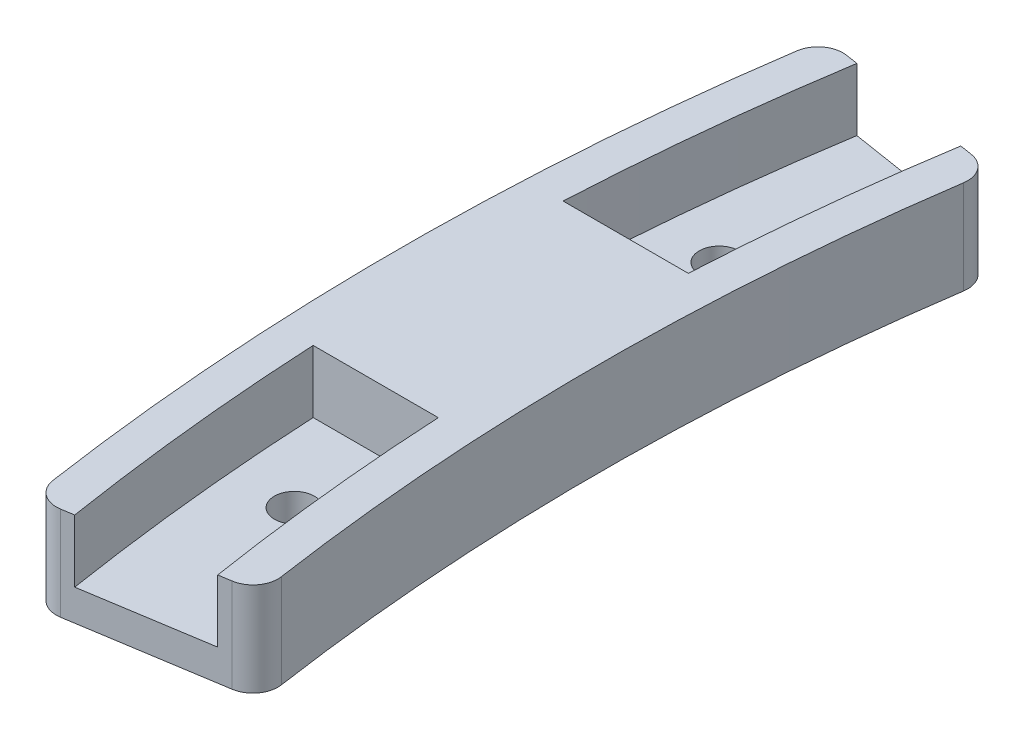
ISO-10303-21;
HEADER;
FILE_DESCRIPTION(('STEP AP214'),'2;1');
FILE_NAME('part.step','',(''),(''),'','','');
FILE_SCHEMA(('AUTOMOTIVE_DESIGN { 1 0 10303 214 1 1 1 1 }'));
ENDSEC;
DATA;
#1=APPLICATION_CONTEXT('core data for automotive mechanical design processes');
#2=APPLICATION_PROTOCOL_DEFINITION('international standard','automotive_design',2000,#1);
#3=PRODUCT_CONTEXT('',#1,'mechanical');
#4=PRODUCT('Part','Part','',(#3));
#5=PRODUCT_RELATED_PRODUCT_CATEGORY('part','',(#4));
#6=PRODUCT_DEFINITION_FORMATION('','',#4);
#7=PRODUCT_DEFINITION_CONTEXT('part definition',#1,'design');
#8=PRODUCT_DEFINITION('design','',#6,#7);
#9=PRODUCT_DEFINITION_SHAPE('','',#8);
#10=(LENGTH_UNIT() NAMED_UNIT(*) SI_UNIT(.MILLI.,.METRE.));
#11=(NAMED_UNIT(*) PLANE_ANGLE_UNIT() SI_UNIT($,.RADIAN.));
#12=(NAMED_UNIT(*) SI_UNIT($,.STERADIAN.) SOLID_ANGLE_UNIT());
#13=UNCERTAINTY_MEASURE_WITH_UNIT(LENGTH_MEASURE(1.E-05),#10,'distance_accuracy_value','');
#14=(GEOMETRIC_REPRESENTATION_CONTEXT(3) GLOBAL_UNCERTAINTY_ASSIGNED_CONTEXT((#13)) GLOBAL_UNIT_ASSIGNED_CONTEXT((#10,
#11,#12)) REPRESENTATION_CONTEXT('',''));
#15=CARTESIAN_POINT('',(0.,0.,0.));
#16=DIRECTION('',(0.,0.,1.));
#17=DIRECTION('',(1.,0.,0.));
#18=AXIS2_PLACEMENT_3D('',#15,#16,#17);
#19=CARTESIAN_POINT('',(0.,10.,0.));
#20=DIRECTION('',(0.156434465040231,0.,0.987688340595138));
#21=DIRECTION('',(0.987688340595138,0.,-0.156434465040231));
#22=AXIS2_PLACEMENT_3D('',#19,#20,#21);
#23=PLANE('',#22);
#24=DIRECTION('',(0.,1.,0.));
#25=VECTOR('',#24,1.);
#26=CARTESIAN_POINT('',(-198.515528471673,0.,31.4417708727155));
#27=LINE('',#26,#25);
#28=CARTESIAN_POINT('',(-198.515528471673,10.,31.4417708727155));
#29=VERTEX_POINT('',#28);
#30=CARTESIAN_POINT('',(-198.515528471673,2.5,31.4417708727155));
#31=VERTEX_POINT('',#30);
#32=EDGE_CURVE('E11',#29,#31,#27,.F.);
#33=ORIENTED_EDGE('',*,*,#32,.T.);
#34=DIRECTION('',(-0.987688340595138,0.,0.15643446504023));
#35=VECTOR('',#34,1.);
#36=CARTESIAN_POINT('',(-186.662644351399,2.5,29.5644584550944));
#37=LINE('',#36,#35);
#38=CARTESIAN_POINT('',(-186.662644351399,2.5,29.5644584550944));
#39=VERTEX_POINT('',#38);
#40=EDGE_CURVE('E154',#39,#31,#37,.T.);
#41=ORIENTED_EDGE('',*,*,#40,.F.);
#42=DIRECTION('',(0.,-1.,0.));
#43=VECTOR('',#42,1.);
#44=CARTESIAN_POINT('',(-186.662644351399,10.,29.5644584550944));
#45=LINE('',#44,#43);
#46=CARTESIAN_POINT('',(-186.662644351399,10.,29.5644584550944));
#47=VERTEX_POINT('',#46);
#48=EDGE_CURVE('E43',#39,#47,#45,.F.);
#49=ORIENTED_EDGE('',*,*,#48,.T.);
#50=DIRECTION('',(-0.987688340595138,0.,0.156434465040231));
#51=VECTOR('',#50,1.);
#52=CARTESIAN_POINT('',(0.,10.,0.));
#53=LINE('',#52,#51);
#54=CARTESIAN_POINT('',(-187.660784713076,10.,29.7225483576439));
#55=VERTEX_POINT('',#54);
#56=EDGE_CURVE('E198',#47,#55,#53,.T.);
#57=ORIENTED_EDGE('',*,*,#56,.T.);
#58=DIRECTION('',(0.,1.,0.));
#59=VECTOR('',#58,1.);
#60=CARTESIAN_POINT('',(-187.660784713076,5.,29.7225483576439));
#61=LINE('',#60,#59);
#62=CARTESIAN_POINT('',(-187.660784713076,5.,29.7225483576439));
#63=VERTEX_POINT('',#62);
#64=EDGE_CURVE('E249',#63,#55,#61,.T.);
#65=ORIENTED_EDGE('',*,*,#64,.F.);
#66=DIRECTION('',(0.987688340595138,0.,-0.156434465040231));
#67=VECTOR('',#66,1.);
#68=CARTESIAN_POINT('',(0.,5.,0.));
#69=LINE('',#68,#67);
#70=CARTESIAN_POINT('',(-197.537668119027,5.,31.2868930080462));
#71=VERTEX_POINT('',#70);
#72=EDGE_CURVE('E268',#71,#63,#69,.T.);
#73=ORIENTED_EDGE('',*,*,#72,.F.);
#74=DIRECTION('',(0.,1.,0.));
#75=VECTOR('',#74,1.);
#76=CARTESIAN_POINT('',(-197.537668119027,5.,31.2868930080462));
#77=LINE('',#76,#75);
#78=CARTESIAN_POINT('',(-197.537668119027,10.,31.2868930080462));
#79=VERTEX_POINT('',#78);
#80=EDGE_CURVE('E280',#71,#79,#77,.T.);
#81=ORIENTED_EDGE('',*,*,#80,.T.);
#82=EDGE_CURVE('E208',#79,#29,#53,.T.);
#83=ORIENTED_EDGE('',*,*,#82,.T.);
#84=EDGE_LOOP('',(#33,#41,#49,#57,#65,#73,#81,#83));
#85=FACE_BOUND('',#84,.T.);
#86=ADVANCED_FACE('F35',(#85),#23,.T.);
#87=CARTESIAN_POINT('',(0.,10.,0.));
#88=DIRECTION('',(0.156434465040232,0.,-0.987688340595138));
#89=DIRECTION('',(-0.987688340595138,0.,-0.156434465040232));
#90=AXIS2_PLACEMENT_3D('',#87,#88,#89);
#91=PLANE('',#90);
#92=DIRECTION('',(0.,-1.,0.));
#93=VECTOR('',#92,1.);
#94=CARTESIAN_POINT('',(-186.662644351399,10.,-29.5644584550945));
#95=LINE('',#94,#93);
#96=CARTESIAN_POINT('',(-186.662644351399,10.,-29.5644584550945));
#97=VERTEX_POINT('',#96);
#98=CARTESIAN_POINT('',(-186.662644351399,2.5,-29.5644584550945));
#99=VERTEX_POINT('',#98);
#100=EDGE_CURVE('E175',#97,#99,#95,.T.);
#101=ORIENTED_EDGE('',*,*,#100,.T.);
#102=DIRECTION('',(0.987688340595138,0.,0.156434465040232));
#103=VECTOR('',#102,1.);
#104=CARTESIAN_POINT('',(-198.515528471673,2.5,-31.4417708727157));
#105=LINE('',#104,#103);
#106=CARTESIAN_POINT('',(-198.515528471673,2.5,-31.4417708727157));
#107=VERTEX_POINT('',#106);
#108=EDGE_CURVE('E467',#107,#99,#105,.T.);
#109=ORIENTED_EDGE('',*,*,#108,.F.);
#110=DIRECTION('',(0.,1.,0.));
#111=VECTOR('',#110,1.);
#112=CARTESIAN_POINT('',(-198.515528471673,10.,-31.4417708727156));
#113=LINE('',#112,#111);
#114=CARTESIAN_POINT('',(-198.515528471673,10.,-31.4417708727157));
#115=VERTEX_POINT('',#114);
#116=EDGE_CURVE('E183',#107,#115,#113,.T.);
#117=ORIENTED_EDGE('',*,*,#116,.T.);
#118=DIRECTION('',(0.987688340595138,0.,0.156434465040232));
#119=VECTOR('',#118,1.);
#120=CARTESIAN_POINT('',(0.,10.,0.));
#121=LINE('',#120,#119);
#122=CARTESIAN_POINT('',(-197.537668119028,10.,-31.2868930080463));
#123=VERTEX_POINT('',#122);
#124=EDGE_CURVE('E177',#115,#123,#121,.T.);
#125=ORIENTED_EDGE('',*,*,#124,.T.);
#126=DIRECTION('',(0.,1.,0.));
#127=VECTOR('',#126,1.);
#128=CARTESIAN_POINT('',(-197.537668119028,5.,-31.2868930080463));
#129=LINE('',#128,#127);
#130=CARTESIAN_POINT('',(-197.537668119028,5.,-31.2868930080463));
#131=VERTEX_POINT('',#130);
#132=EDGE_CURVE('E225',#131,#123,#129,.T.);
#133=ORIENTED_EDGE('',*,*,#132,.F.);
#134=DIRECTION('',(-0.987688340595138,0.,-0.156434465040232));
#135=VECTOR('',#134,1.);
#136=CARTESIAN_POINT('',(0.,5.,0.));
#137=LINE('',#136,#135);
#138=CARTESIAN_POINT('',(-187.660784713076,5.,-29.722548357644));
#139=VERTEX_POINT('',#138);
#140=EDGE_CURVE('E255',#139,#131,#137,.T.);
#141=ORIENTED_EDGE('',*,*,#140,.F.);
#142=DIRECTION('',(0.,1.,0.));
#143=VECTOR('',#142,1.);
#144=CARTESIAN_POINT('',(-187.660784713076,5.,-29.722548357644));
#145=LINE('',#144,#143);
#146=CARTESIAN_POINT('',(-187.660784713076,10.,-29.722548357644));
#147=VERTEX_POINT('',#146);
#148=EDGE_CURVE('E256',#139,#147,#145,.T.);
#149=ORIENTED_EDGE('',*,*,#148,.T.);
#150=EDGE_CURVE('E216',#147,#97,#121,.T.);
#151=ORIENTED_EDGE('',*,*,#150,.T.);
#152=EDGE_LOOP('',(#101,#109,#117,#125,#133,#141,#149,#151));
#153=FACE_BOUND('',#152,.T.);
#154=ADVANCED_FACE('F223',(#153),#91,.T.);
#155=CARTESIAN_POINT('',(0.,10.,0.));
#156=DIRECTION('',(0.,-1.,0.));
#157=DIRECTION('',(0.,0.,-1.));
#158=AXIS2_PLACEMENT_3D('',#155,#156,#157);
#159=CYLINDRICAL_SURFACE('',#158,187.);
#160=DIRECTION('',(0.,-1.,0.));
#161=VECTOR('',#160,1.);
#162=CARTESIAN_POINT('',(-184.996936421358,10.,27.2971338186247));
#163=LINE('',#162,#161);
#164=CARTESIAN_POINT('',(-184.996936421358,10.,27.2971338186247));
#165=VERTEX_POINT('',#164);
#166=CARTESIAN_POINT('',(-184.996936421358,2.5,27.2971338186247));
#167=VERTEX_POINT('',#166);
#168=EDGE_CURVE('E191',#165,#167,#163,.T.);
#169=ORIENTED_EDGE('',*,*,#168,.T.);
#170=CARTESIAN_POINT('',(0.,2.5,0.));
#171=DIRECTION('',(0.,1.,0.));
#172=DIRECTION('',(0.,0.,-1.));
#173=AXIS2_PLACEMENT_3D('',#170,#171,#172);
#174=CIRCLE('',#173,187.);
#175=CARTESIAN_POINT('',(-184.996936421358,2.5,-27.2971338186248));
#176=VERTEX_POINT('',#175);
#177=EDGE_CURVE('E50',#176,#167,#174,.T.);
#178=ORIENTED_EDGE('',*,*,#177,.F.);
#179=DIRECTION('',(0.,-1.,0.));
#180=VECTOR('',#179,1.);
#181=CARTESIAN_POINT('',(-184.996936421358,10.,-27.2971338186248));
#182=LINE('',#181,#180);
#183=CARTESIAN_POINT('',(-184.996936421358,10.,-27.2971338186248));
#184=VERTEX_POINT('',#183);
#185=EDGE_CURVE('E194',#176,#184,#182,.F.);
#186=ORIENTED_EDGE('',*,*,#185,.T.);
#187=CARTESIAN_POINT('',(0.,10.,0.));
#188=DIRECTION('',(0.,1.,0.));
#189=DIRECTION('',(0.,0.,1.));
#190=AXIS2_PLACEMENT_3D('',#187,#188,#189);
#191=CIRCLE('',#190,187.);
#192=EDGE_CURVE('E207',#184,#165,#191,.T.);
#193=ORIENTED_EDGE('',*,*,#192,.T.);
#194=EDGE_LOOP('',(#169,#178,#186,#193));
#195=FACE_BOUND('',#194,.T.);
#196=ADVANCED_FACE('F213',(#195),#159,.F.);
#197=CARTESIAN_POINT('',(0.,10.,0.));
#198=DIRECTION('',(0.,-1.,0.));
#199=DIRECTION('',(0.,0.,-1.));
#200=AXIS2_PLACEMENT_3D('',#197,#198,#199);
#201=CYLINDRICAL_SURFACE('',#200,203.);
#202=CARTESIAN_POINT('',(0.,2.5,0.));
#203=DIRECTION('',(0.,-1.,0.));
#204=DIRECTION('',(0.,0.,-1.));
#205=AXIS2_PLACEMENT_3D('',#202,#203,#204);
#206=CIRCLE('',#205,203.);
#207=CARTESIAN_POINT('',(-200.806789415701,2.5,29.7595921436797));
#208=VERTEX_POINT('',#207);
#209=CARTESIAN_POINT('',(-200.806789415701,2.5,-29.7595921436798));
#210=VERTEX_POINT('',#209);
#211=EDGE_CURVE('E151',#208,#210,#206,.T.);
#212=ORIENTED_EDGE('',*,*,#211,.F.);
#213=DIRECTION('',(0.,-1.,0.));
#214=VECTOR('',#213,1.);
#215=CARTESIAN_POINT('',(-200.806789415701,10.,29.7595921436797));
#216=LINE('',#215,#214);
#217=CARTESIAN_POINT('',(-200.806789415701,10.,29.7595921436797));
#218=VERTEX_POINT('',#217);
#219=EDGE_CURVE('E164',#208,#218,#216,.F.);
#220=ORIENTED_EDGE('',*,*,#219,.T.);
#221=CARTESIAN_POINT('',(0.,10.,0.));
#222=DIRECTION('',(0.,1.,0.));
#223=DIRECTION('',(0.,0.,1.));
#224=AXIS2_PLACEMENT_3D('',#221,#222,#223);
#225=CIRCLE('',#224,203.);
#226=CARTESIAN_POINT('',(-200.806789415701,10.,-29.7595921436798));
#227=VERTEX_POINT('',#226);
#228=EDGE_CURVE('E173',#227,#218,#225,.T.);
#229=ORIENTED_EDGE('',*,*,#228,.F.);
#230=DIRECTION('',(0.,-1.,0.));
#231=VECTOR('',#230,1.);
#232=CARTESIAN_POINT('',(-200.806789415701,10.,-29.7595921436798));
#233=LINE('',#232,#231);
#234=EDGE_CURVE('E167',#227,#210,#233,.T.);
#235=ORIENTED_EDGE('',*,*,#234,.T.);
#236=EDGE_LOOP('',(#212,#220,#229,#235));
#237=FACE_BOUND('',#236,.T.);
#238=ADVANCED_FACE('F162',(#237),#201,.T.);
#239=CARTESIAN_POINT('',(-198.828397401754,10.,-29.4663941915254));
#240=DIRECTION('',(0.,-1.,0.));
#241=DIRECTION('',(0.,0.,-1.));
#242=AXIS2_PLACEMENT_3D('',#239,#240,#241);
#243=CYLINDRICAL_SURFACE('',#242,2.);
#244=ORIENTED_EDGE('',*,*,#116,.F.);
#245=CARTESIAN_POINT('',(-198.828397401754,2.5,-29.4663941915254));
#246=DIRECTION('',(0.,-1.,0.));
#247=DIRECTION('',(0.,0.,-1.));
#248=AXIS2_PLACEMENT_3D('',#245,#246,#247);
#249=CIRCLE('',#248,2.00000000000001);
#250=EDGE_CURVE('E168',#210,#107,#249,.T.);
#251=ORIENTED_EDGE('',*,*,#250,.F.);
#252=ORIENTED_EDGE('',*,*,#234,.F.);
#253=CARTESIAN_POINT('',(-198.828397401754,10.,-29.4663941915254));
#254=DIRECTION('',(0.,1.,0.));
#255=DIRECTION('',(0.,0.,1.));
#256=AXIS2_PLACEMENT_3D('',#253,#254,#255);
#257=CIRCLE('',#256,2.);
#258=EDGE_CURVE('E189',#115,#227,#257,.T.);
#259=ORIENTED_EDGE('',*,*,#258,.F.);
#260=EDGE_LOOP('',(#244,#251,#252,#259));
#261=FACE_BOUND('',#260,.T.);
#262=ADVANCED_FACE('F315',(#261),#243,.T.);
#263=CARTESIAN_POINT('',(-186.97551328148,10.,-27.5890817739042));
#264=DIRECTION('',(0.,-1.,0.));
#265=DIRECTION('',(0.,0.,-1.));
#266=AXIS2_PLACEMENT_3D('',#263,#264,#265);
#267=CYLINDRICAL_SURFACE('',#266,2.);
#268=ORIENTED_EDGE('',*,*,#185,.F.);
#269=CARTESIAN_POINT('',(-186.97551328148,2.5,-27.5890817739042));
#270=DIRECTION('',(0.,-1.,0.));
#271=DIRECTION('',(0.,0.,-1.));
#272=AXIS2_PLACEMENT_3D('',#269,#270,#271);
#273=CIRCLE('',#272,2.);
#274=EDGE_CURVE('E469',#99,#176,#273,.T.);
#275=ORIENTED_EDGE('',*,*,#274,.F.);
#276=ORIENTED_EDGE('',*,*,#100,.F.);
#277=CARTESIAN_POINT('',(-186.97551328148,10.,-27.5890817739042));
#278=DIRECTION('',(0.,1.,0.));
#279=DIRECTION('',(0.,0.,1.));
#280=AXIS2_PLACEMENT_3D('',#277,#278,#279);
#281=CIRCLE('',#280,2.);
#282=EDGE_CURVE('E187',#184,#97,#281,.T.);
#283=ORIENTED_EDGE('',*,*,#282,.F.);
#284=EDGE_LOOP('',(#268,#275,#276,#283));
#285=FACE_BOUND('',#284,.T.);
#286=ADVANCED_FACE('F318',(#285),#267,.T.);
#287=CARTESIAN_POINT('',(-198.828397401754,10.,29.4663941915252));
#288=DIRECTION('',(0.,-1.,0.));
#289=DIRECTION('',(0.,0.,-1.));
#290=AXIS2_PLACEMENT_3D('',#287,#288,#289);
#291=CYLINDRICAL_SURFACE('',#290,2.);
#292=ORIENTED_EDGE('',*,*,#219,.F.);
#293=CARTESIAN_POINT('',(-198.828397401754,2.5,29.4663941915252));
#294=DIRECTION('',(0.,-1.,0.));
#295=DIRECTION('',(0.,0.,-1.));
#296=AXIS2_PLACEMENT_3D('',#293,#294,#295);
#297=CIRCLE('',#296,2.00000000000001);
#298=EDGE_CURVE('E148',#31,#208,#297,.T.);
#299=ORIENTED_EDGE('',*,*,#298,.F.);
#300=ORIENTED_EDGE('',*,*,#32,.F.);
#301=CARTESIAN_POINT('',(-198.828397401754,10.,29.4663941915252));
#302=DIRECTION('',(0.,1.,0.));
#303=DIRECTION('',(0.,0.,1.));
#304=AXIS2_PLACEMENT_3D('',#301,#302,#303);
#305=CIRCLE('',#304,2.);
#306=EDGE_CURVE('E172',#218,#29,#305,.T.);
#307=ORIENTED_EDGE('',*,*,#306,.F.);
#308=EDGE_LOOP('',(#292,#299,#300,#307));
#309=FACE_BOUND('',#308,.T.);
#310=ADVANCED_FACE('F171',(#309),#291,.T.);
#311=CARTESIAN_POINT('',(-186.97551328148,10.,27.5890817739041));
#312=DIRECTION('',(0.,-1.,0.));
#313=DIRECTION('',(0.,0.,-1.));
#314=AXIS2_PLACEMENT_3D('',#311,#312,#313);
#315=CYLINDRICAL_SURFACE('',#314,2.);
#316=ORIENTED_EDGE('',*,*,#48,.F.);
#317=CARTESIAN_POINT('',(-186.97551328148,2.5,27.5890817739041));
#318=DIRECTION('',(0.,-1.,0.));
#319=DIRECTION('',(0.,0.,-1.));
#320=AXIS2_PLACEMENT_3D('',#317,#318,#319);
#321=CIRCLE('',#320,2.00000000000002);
#322=EDGE_CURVE('E211',#167,#39,#321,.T.);
#323=ORIENTED_EDGE('',*,*,#322,.F.);
#324=ORIENTED_EDGE('',*,*,#168,.F.);
#325=CARTESIAN_POINT('',(-186.97551328148,10.,27.5890817739041));
#326=DIRECTION('',(0.,1.,0.));
#327=DIRECTION('',(0.,0.,1.));
#328=AXIS2_PLACEMENT_3D('',#325,#326,#327);
#329=CIRCLE('',#328,2.);
#330=EDGE_CURVE('E58',#47,#165,#329,.T.);
#331=ORIENTED_EDGE('',*,*,#330,.F.);
#332=EDGE_LOOP('',(#316,#323,#324,#331));
#333=FACE_BOUND('',#332,.T.);
#334=ADVANCED_FACE('F37',(#333),#315,.T.);
#335=CARTESIAN_POINT('',(0.,10.,0.));
#336=DIRECTION('',(0.,1.,0.));
#337=DIRECTION('',(0.,0.,1.));
#338=AXIS2_PLACEMENT_3D('',#335,#336,#337);
#339=PLANE('',#338);
#340=ORIENTED_EDGE('',*,*,#124,.F.);
#341=ORIENTED_EDGE('',*,*,#258,.T.);
#342=ORIENTED_EDGE('',*,*,#228,.T.);
#343=ORIENTED_EDGE('',*,*,#306,.T.);
#344=ORIENTED_EDGE('',*,*,#82,.F.);
#345=CARTESIAN_POINT('',(0.,10.,0.));
#346=DIRECTION('',(0.,1.,0.));
#347=DIRECTION('',(0.,0.,1.));
#348=AXIS2_PLACEMENT_3D('',#345,#346,#347);
#349=CIRCLE('',#348,200.);
#350=CARTESIAN_POINT('',(-199.749843554382,10.,10.));
#351=VERTEX_POINT('',#350);
#352=EDGE_CURVE('E276',#351,#79,#349,.T.);
#353=ORIENTED_EDGE('',*,*,#352,.F.);
#354=DIRECTION('',(-1.,0.,0.));
#355=VECTOR('',#354,1.);
#356=CARTESIAN_POINT('',(0.,10.,10.));
#357=LINE('',#356,#355);
#358=CARTESIAN_POINT('',(-189.736659610103,10.,10.));
#359=VERTEX_POINT('',#358);
#360=EDGE_CURVE('E274',#359,#351,#357,.T.);
#361=ORIENTED_EDGE('',*,*,#360,.F.);
#362=CARTESIAN_POINT('',(0.,10.,0.));
#363=DIRECTION('',(0.,1.,0.));
#364=DIRECTION('',(0.,0.,1.));
#365=AXIS2_PLACEMENT_3D('',#362,#363,#364);
#366=CIRCLE('',#365,190.);
#367=EDGE_CURVE('E206',#359,#55,#366,.T.);
#368=ORIENTED_EDGE('',*,*,#367,.T.);
#369=ORIENTED_EDGE('',*,*,#56,.F.);
#370=ORIENTED_EDGE('',*,*,#330,.T.);
#371=ORIENTED_EDGE('',*,*,#192,.F.);
#372=ORIENTED_EDGE('',*,*,#282,.T.);
#373=ORIENTED_EDGE('',*,*,#150,.F.);
#374=CARTESIAN_POINT('',(0.,10.,0.));
#375=DIRECTION('',(0.,1.,0.));
#376=DIRECTION('',(0.,0.,1.));
#377=AXIS2_PLACEMENT_3D('',#374,#375,#376);
#378=CIRCLE('',#377,190.);
#379=CARTESIAN_POINT('',(-189.736659610103,10.,-9.99999999999999));
#380=VERTEX_POINT('',#379);
#381=EDGE_CURVE('E247',#147,#380,#378,.T.);
#382=ORIENTED_EDGE('',*,*,#381,.T.);
#383=DIRECTION('',(-1.,0.,0.));
#384=VECTOR('',#383,1.);
#385=CARTESIAN_POINT('',(0.,10.,-10.));
#386=LINE('',#385,#384);
#387=CARTESIAN_POINT('',(-199.749843554382,10.,-9.99999999999999));
#388=VERTEX_POINT('',#387);
#389=EDGE_CURVE('E244',#380,#388,#386,.T.);
#390=ORIENTED_EDGE('',*,*,#389,.T.);
#391=CARTESIAN_POINT('',(0.,10.,0.));
#392=DIRECTION('',(0.,1.,0.));
#393=DIRECTION('',(0.,0.,1.));
#394=AXIS2_PLACEMENT_3D('',#391,#392,#393);
#395=CIRCLE('',#394,200.);
#396=EDGE_CURVE('E234',#123,#388,#395,.T.);
#397=ORIENTED_EDGE('',*,*,#396,.F.);
#398=EDGE_LOOP('',(#340,#341,#342,#343,#344,#353,#361,#368,#369,#370,#371,#372,#373,#382,#390,#397));
#399=FACE_BOUND('',#398,.T.);
#400=ADVANCED_FACE('F203',(#399),#339,.T.);
#401=CARTESIAN_POINT('',(0.,5.,10.));
#402=DIRECTION('',(0.,0.,-1.));
#403=DIRECTION('',(-1.,0.,0.));
#404=AXIS2_PLACEMENT_3D('',#401,#402,#403);
#405=PLANE('',#404);
#406=ORIENTED_EDGE('',*,*,#360,.T.);
#407=DIRECTION('',(0.,1.,0.));
#408=VECTOR('',#407,1.);
#409=CARTESIAN_POINT('',(-199.749843554382,5.,10.));
#410=LINE('',#409,#408);
#411=CARTESIAN_POINT('',(-199.749843554382,5.,10.));
#412=VERTEX_POINT('',#411);
#413=EDGE_CURVE('E273',#412,#351,#410,.T.);
#414=ORIENTED_EDGE('',*,*,#413,.F.);
#415=DIRECTION('',(-1.,0.,0.));
#416=VECTOR('',#415,1.);
#417=CARTESIAN_POINT('',(0.,5.,10.));
#418=LINE('',#417,#416);
#419=CARTESIAN_POINT('',(-189.736659610103,5.,10.));
#420=VERTEX_POINT('',#419);
#421=EDGE_CURVE('E262',#420,#412,#418,.T.);
#422=ORIENTED_EDGE('',*,*,#421,.F.);
#423=DIRECTION('',(0.,1.,0.));
#424=VECTOR('',#423,1.);
#425=CARTESIAN_POINT('',(-189.736659610103,5.,10.));
#426=LINE('',#425,#424);
#427=EDGE_CURVE('E245',#420,#359,#426,.T.);
#428=ORIENTED_EDGE('',*,*,#427,.T.);
#429=EDGE_LOOP('',(#406,#414,#422,#428));
#430=FACE_BOUND('',#429,.T.);
#431=ADVANCED_FACE('F295',(#430),#405,.F.);
#432=CARTESIAN_POINT('',(0.,5.,0.));
#433=DIRECTION('',(0.,1.,0.));
#434=DIRECTION('',(0.,0.,1.));
#435=AXIS2_PLACEMENT_3D('',#432,#433,#434);
#436=CYLINDRICAL_SURFACE('',#435,190.);
#437=ORIENTED_EDGE('',*,*,#367,.F.);
#438=ORIENTED_EDGE('',*,*,#427,.F.);
#439=CARTESIAN_POINT('',(0.,5.,0.));
#440=DIRECTION('',(0.,1.,0.));
#441=DIRECTION('',(0.,0.,1.));
#442=AXIS2_PLACEMENT_3D('',#439,#440,#441);
#443=CIRCLE('',#442,190.);
#444=EDGE_CURVE('E271',#420,#63,#443,.T.);
#445=ORIENTED_EDGE('',*,*,#444,.T.);
#446=ORIENTED_EDGE('',*,*,#64,.T.);
#447=EDGE_LOOP('',(#437,#438,#445,#446));
#448=FACE_BOUND('',#447,.T.);
#449=ADVANCED_FACE('F297',(#448),#436,.T.);
#450=CARTESIAN_POINT('',(0.,5.,0.));
#451=DIRECTION('',(0.,1.,0.));
#452=DIRECTION('',(0.,0.,1.));
#453=AXIS2_PLACEMENT_3D('',#450,#451,#452);
#454=CYLINDRICAL_SURFACE('',#453,200.);
#455=ORIENTED_EDGE('',*,*,#352,.T.);
#456=ORIENTED_EDGE('',*,*,#80,.F.);
#457=CARTESIAN_POINT('',(0.,5.,0.));
#458=DIRECTION('',(0.,1.,0.));
#459=DIRECTION('',(0.,0.,1.));
#460=AXIS2_PLACEMENT_3D('',#457,#458,#459);
#461=CIRCLE('',#460,200.);
#462=EDGE_CURVE('E265',#412,#71,#461,.T.);
#463=ORIENTED_EDGE('',*,*,#462,.F.);
#464=ORIENTED_EDGE('',*,*,#413,.T.);
#465=EDGE_LOOP('',(#455,#456,#463,#464));
#466=FACE_BOUND('',#465,.T.);
#467=ADVANCED_FACE('F286',(#466),#454,.F.);
#468=CARTESIAN_POINT('',(0.,5.,0.));
#469=DIRECTION('',(0.,1.,0.));
#470=DIRECTION('',(0.,0.,1.));
#471=AXIS2_PLACEMENT_3D('',#468,#469,#470);
#472=PLANE('',#471);
#473=CARTESIAN_POINT('',(-194.25796612789,5.,16.9953698357934));
#474=DIRECTION('',(0.,1.,0.));
#475=DIRECTION('',(0.,0.,1.));
#476=AXIS2_PLACEMENT_3D('',#473,#474,#475);
#477=CIRCLE('',#476,1.59999999999999);
#478=CARTESIAN_POINT('',(-194.25796612789,5.,18.5953698357934));
#479=VERTEX_POINT('',#478);
#480=EDGE_CURVE('E158',#479,#479,#477,.T.);
#481=ORIENTED_EDGE('',*,*,#480,.F.);
#482=EDGE_LOOP('',(#481));
#483=FACE_BOUND('',#482,.T.);
#484=ORIENTED_EDGE('',*,*,#421,.T.);
#485=ORIENTED_EDGE('',*,*,#462,.T.);
#486=ORIENTED_EDGE('',*,*,#72,.T.);
#487=ORIENTED_EDGE('',*,*,#444,.F.);
#488=EDGE_LOOP('',(#484,#485,#486,#487));
#489=FACE_BOUND('',#488,.T.);
#490=ADVANCED_FACE('F293',(#483,#489),#472,.T.);
#491=CARTESIAN_POINT('',(0.,5.,0.));
#492=DIRECTION('',(0.,1.,0.));
#493=DIRECTION('',(0.,0.,1.));
#494=AXIS2_PLACEMENT_3D('',#491,#492,#493);
#495=CYLINDRICAL_SURFACE('',#494,190.);
#496=ORIENTED_EDGE('',*,*,#381,.F.);
#497=ORIENTED_EDGE('',*,*,#148,.F.);
#498=CARTESIAN_POINT('',(0.,5.,0.));
#499=DIRECTION('',(0.,1.,0.));
#500=DIRECTION('',(0.,0.,1.));
#501=AXIS2_PLACEMENT_3D('',#498,#499,#500);
#502=CIRCLE('',#501,190.);
#503=CARTESIAN_POINT('',(-189.736659610103,5.,-9.99999999999999));
#504=VERTEX_POINT('',#503);
#505=EDGE_CURVE('E240',#139,#504,#502,.T.);
#506=ORIENTED_EDGE('',*,*,#505,.T.);
#507=DIRECTION('',(0.,1.,0.));
#508=VECTOR('',#507,1.);
#509=CARTESIAN_POINT('',(-189.736659610103,5.,-9.99999999999999));
#510=LINE('',#509,#508);
#511=EDGE_CURVE('E259',#504,#380,#510,.T.);
#512=ORIENTED_EDGE('',*,*,#511,.T.);
#513=EDGE_LOOP('',(#496,#497,#506,#512));
#514=FACE_BOUND('',#513,.T.);
#515=ADVANCED_FACE('F377',(#514),#495,.T.);
#516=CARTESIAN_POINT('',(0.,5.,-10.));
#517=DIRECTION('',(0.,0.,-1.));
#518=DIRECTION('',(-1.,0.,0.));
#519=AXIS2_PLACEMENT_3D('',#516,#517,#518);
#520=PLANE('',#519);
#521=ORIENTED_EDGE('',*,*,#389,.F.);
#522=ORIENTED_EDGE('',*,*,#511,.F.);
#523=DIRECTION('',(-1.,0.,0.));
#524=VECTOR('',#523,1.);
#525=CARTESIAN_POINT('',(0.,5.,-10.));
#526=LINE('',#525,#524);
#527=CARTESIAN_POINT('',(-199.749843554382,5.,-9.99999999999999));
#528=VERTEX_POINT('',#527);
#529=EDGE_CURVE('E475',#504,#528,#526,.T.);
#530=ORIENTED_EDGE('',*,*,#529,.T.);
#531=DIRECTION('',(0.,1.,0.));
#532=VECTOR('',#531,1.);
#533=CARTESIAN_POINT('',(-199.749843554382,5.,-9.99999999999999));
#534=LINE('',#533,#532);
#535=EDGE_CURVE('E239',#528,#388,#534,.T.);
#536=ORIENTED_EDGE('',*,*,#535,.T.);
#537=EDGE_LOOP('',(#521,#522,#530,#536));
#538=FACE_BOUND('',#537,.T.);
#539=ADVANCED_FACE('F366',(#538),#520,.T.);
#540=CARTESIAN_POINT('',(0.,5.,0.));
#541=DIRECTION('',(0.,1.,0.));
#542=DIRECTION('',(0.,0.,1.));
#543=AXIS2_PLACEMENT_3D('',#540,#541,#542);
#544=CYLINDRICAL_SURFACE('',#543,200.);
#545=ORIENTED_EDGE('',*,*,#396,.T.);
#546=ORIENTED_EDGE('',*,*,#535,.F.);
#547=CARTESIAN_POINT('',(0.,5.,0.));
#548=DIRECTION('',(0.,1.,0.));
#549=DIRECTION('',(0.,0.,1.));
#550=AXIS2_PLACEMENT_3D('',#547,#548,#549);
#551=CIRCLE('',#550,200.);
#552=EDGE_CURVE('E237',#131,#528,#551,.T.);
#553=ORIENTED_EDGE('',*,*,#552,.F.);
#554=ORIENTED_EDGE('',*,*,#132,.T.);
#555=EDGE_LOOP('',(#545,#546,#553,#554));
#556=FACE_BOUND('',#555,.T.);
#557=ADVANCED_FACE('F232',(#556),#544,.F.);
#558=CARTESIAN_POINT('',(0.,5.,0.));
#559=DIRECTION('',(0.,1.,0.));
#560=DIRECTION('',(0.,0.,1.));
#561=AXIS2_PLACEMENT_3D('',#558,#559,#560);
#562=PLANE('',#561);
#563=CARTESIAN_POINT('',(-194.25796612789,5.,-16.9953698357934));
#564=DIRECTION('',(0.,1.,0.));
#565=DIRECTION('',(0.,0.,1.));
#566=AXIS2_PLACEMENT_3D('',#563,#564,#565);
#567=CIRCLE('',#566,1.59999999999999);
#568=CARTESIAN_POINT('',(-194.25796612789,5.,-15.3953698357934));
#569=VERTEX_POINT('',#568);
#570=EDGE_CURVE('E454',#569,#569,#567,.T.);
#571=ORIENTED_EDGE('',*,*,#570,.F.);
#572=EDGE_LOOP('',(#571));
#573=FACE_BOUND('',#572,.T.);
#574=ORIENTED_EDGE('',*,*,#140,.T.);
#575=ORIENTED_EDGE('',*,*,#552,.T.);
#576=ORIENTED_EDGE('',*,*,#529,.F.);
#577=ORIENTED_EDGE('',*,*,#505,.F.);
#578=EDGE_LOOP('',(#574,#575,#576,#577));
#579=FACE_BOUND('',#578,.T.);
#580=ADVANCED_FACE('F365',(#573,#579),#562,.T.);
#581=CARTESIAN_POINT('',(-198.828397401754,2.5,29.4663941915252));
#582=DIRECTION('',(0.,-1.,0.));
#583=DIRECTION('',(0.,0.,-1.));
#584=AXIS2_PLACEMENT_3D('',#581,#582,#583);
#585=PLANE('',#584);
#586=CARTESIAN_POINT('',(-194.25796612789,2.5,-16.9953698357934));
#587=DIRECTION('',(0.,-1.,0.));
#588=DIRECTION('',(0.,0.,-1.));
#589=AXIS2_PLACEMENT_3D('',#586,#587,#588);
#590=CIRCLE('',#589,1.59999999999999);
#591=CARTESIAN_POINT('',(-194.25796612789,2.5,-18.5953698357934));
#592=VERTEX_POINT('',#591);
#593=EDGE_CURVE('E457',#592,#592,#590,.T.);
#594=ORIENTED_EDGE('',*,*,#593,.F.);
#595=EDGE_LOOP('',(#594));
#596=FACE_BOUND('',#595,.T.);
#597=CARTESIAN_POINT('',(-194.25796612789,2.5,16.9953698357934));
#598=DIRECTION('',(0.,-1.,0.));
#599=DIRECTION('',(0.,0.,-1.));
#600=AXIS2_PLACEMENT_3D('',#597,#598,#599);
#601=CIRCLE('',#600,1.59999999999999);
#602=CARTESIAN_POINT('',(-194.25796612789,2.5,15.3953698357934));
#603=VERTEX_POINT('',#602);
#604=EDGE_CURVE('E459',#603,#603,#601,.T.);
#605=ORIENTED_EDGE('',*,*,#604,.F.);
#606=EDGE_LOOP('',(#605));
#607=FACE_BOUND('',#606,.T.);
#608=ORIENTED_EDGE('',*,*,#298,.T.);
#609=ORIENTED_EDGE('',*,*,#211,.T.);
#610=ORIENTED_EDGE('',*,*,#250,.T.);
#611=ORIENTED_EDGE('',*,*,#108,.T.);
#612=ORIENTED_EDGE('',*,*,#274,.T.);
#613=ORIENTED_EDGE('',*,*,#177,.T.);
#614=ORIENTED_EDGE('',*,*,#322,.T.);
#615=ORIENTED_EDGE('',*,*,#40,.T.);
#616=EDGE_LOOP('',(#608,#609,#610,#611,#612,#613,#614,#615));
#617=FACE_BOUND('',#616,.T.);
#618=ADVANCED_FACE('F150',(#596,#607,#617),#585,.T.);
#619=CARTESIAN_POINT('',(-194.25796612789,2.5,16.9953698357934));
#620=DIRECTION('',(0.,-1.,0.));
#621=DIRECTION('',(0.,0.,-1.));
#622=AXIS2_PLACEMENT_3D('',#619,#620,#621);
#623=CYLINDRICAL_SURFACE('',#622,1.59999999999999);
#624=ORIENTED_EDGE('',*,*,#480,.T.);
#625=EDGE_LOOP('',(#624));
#626=FACE_BOUND('',#625,.T.);
#627=ORIENTED_EDGE('',*,*,#604,.T.);
#628=EDGE_LOOP('',(#627));
#629=FACE_BOUND('',#628,.T.);
#630=ADVANCED_FACE('F427',(#626,#629),#623,.F.);
#631=CARTESIAN_POINT('',(-194.25796612789,2.5,-16.9953698357934));
#632=DIRECTION('',(0.,-1.,0.));
#633=DIRECTION('',(0.,0.,-1.));
#634=AXIS2_PLACEMENT_3D('',#631,#632,#633);
#635=CYLINDRICAL_SURFACE('',#634,1.59999999999999);
#636=ORIENTED_EDGE('',*,*,#570,.T.);
#637=EDGE_LOOP('',(#636));
#638=FACE_BOUND('',#637,.T.);
#639=ORIENTED_EDGE('',*,*,#593,.T.);
#640=EDGE_LOOP('',(#639));
#641=FACE_BOUND('',#640,.T.);
#642=ADVANCED_FACE('F437',(#638,#641),#635,.F.);
#643=CLOSED_SHELL('',(#86,#154,#196,#238,#262,#286,#310,#334,#400,#431,#449,#467,#490,#515,#539,
#557,#580,#618,#630,#642));
#644=MANIFOLD_SOLID_BREP('B2',#643);
#645=ADVANCED_BREP_SHAPE_REPRESENTATION('',(#18,#644),#14);
#646=SHAPE_DEFINITION_REPRESENTATION(#9,#645);
ENDSEC;
END-ISO-10303-21;
